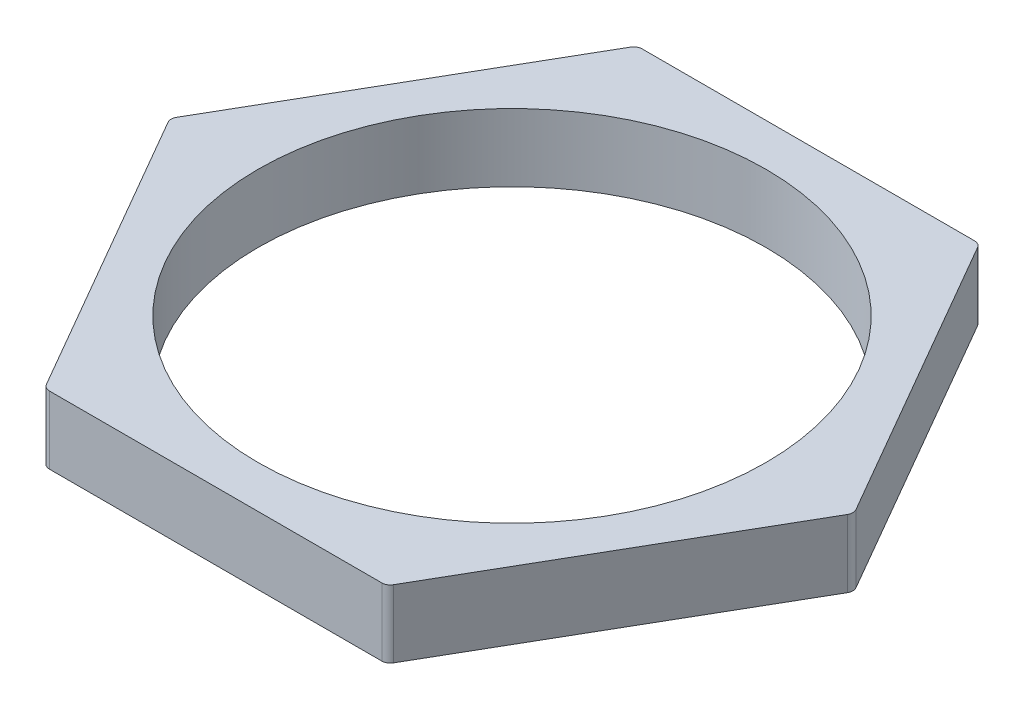
ISO-10303-21;
HEADER;
FILE_DESCRIPTION(('STEP AP214'),'2;1');
FILE_NAME('part.step','',(''),(''),'','','');
FILE_SCHEMA(('AUTOMOTIVE_DESIGN { 1 0 10303 214 1 1 1 1 }'));
ENDSEC;
DATA;
#1=APPLICATION_CONTEXT('core data for automotive mechanical design processes');
#2=APPLICATION_PROTOCOL_DEFINITION('international standard','automotive_design',2000,#1);
#3=PRODUCT_CONTEXT('',#1,'mechanical');
#4=PRODUCT('Part','Part','',(#3));
#5=PRODUCT_RELATED_PRODUCT_CATEGORY('part','',(#4));
#6=PRODUCT_DEFINITION_FORMATION('','',#4);
#7=PRODUCT_DEFINITION_CONTEXT('part definition',#1,'design');
#8=PRODUCT_DEFINITION('design','',#6,#7);
#9=PRODUCT_DEFINITION_SHAPE('','',#8);
#10=(LENGTH_UNIT() NAMED_UNIT(*) SI_UNIT(.MILLI.,.METRE.));
#11=(NAMED_UNIT(*) PLANE_ANGLE_UNIT() SI_UNIT($,.RADIAN.));
#12=(NAMED_UNIT(*) SI_UNIT($,.STERADIAN.) SOLID_ANGLE_UNIT());
#13=UNCERTAINTY_MEASURE_WITH_UNIT(LENGTH_MEASURE(1.E-05),#10,'distance_accuracy_value','');
#14=(GEOMETRIC_REPRESENTATION_CONTEXT(3) GLOBAL_UNCERTAINTY_ASSIGNED_CONTEXT((#13)) GLOBAL_UNIT_ASSIGNED_CONTEXT((#10,
#11,#12)) REPRESENTATION_CONTEXT('',''));
#15=CARTESIAN_POINT('',(0.,0.,0.));
#16=DIRECTION('',(0.,0.,1.));
#17=DIRECTION('',(1.,0.,0.));
#18=AXIS2_PLACEMENT_3D('',#15,#16,#17);
#19=CARTESIAN_POINT('',(9.81495457622364,0.,-17.));
#20=DIRECTION('',(0.,1.,0.));
#21=DIRECTION('',(0.,0.,1.));
#22=AXIS2_PLACEMENT_3D('',#19,#20,#21);
#23=CYLINDRICAL_SURFACE('',#22,0.5);
#24=CARTESIAN_POINT('',(9.81495457622364,4.,-17.));
#25=DIRECTION('',(0.,1.,0.));
#26=DIRECTION('',(0.,0.,1.));
#27=AXIS2_PLACEMENT_3D('',#24,#25,#26);
#28=CIRCLE('',#27,0.5);
#29=CARTESIAN_POINT('',(10.2479672781159,4.,-17.25));
#30=VERTEX_POINT('',#29);
#31=CARTESIAN_POINT('',(9.81495457622364,4.,-17.5));
#32=VERTEX_POINT('',#31);
#33=EDGE_CURVE('E155',#30,#32,#28,.T.);
#34=ORIENTED_EDGE('',*,*,#33,.F.);
#35=DIRECTION('',(0.,1.,0.));
#36=VECTOR('',#35,1.);
#37=CARTESIAN_POINT('',(10.2479672781159,0.,-17.25));
#38=LINE('',#37,#36);
#39=CARTESIAN_POINT('',(10.2479672781159,0.,-17.25));
#40=VERTEX_POINT('',#39);
#41=EDGE_CURVE('E11',#40,#30,#38,.T.);
#42=ORIENTED_EDGE('',*,*,#41,.F.);
#43=CARTESIAN_POINT('',(9.81495457622364,0.,-17.));
#44=DIRECTION('',(0.,1.,0.));
#45=DIRECTION('',(0.,0.,1.));
#46=AXIS2_PLACEMENT_3D('',#43,#44,#45);
#47=CIRCLE('',#46,0.5);
#48=CARTESIAN_POINT('',(9.81495457622364,0.,-17.5));
#49=VERTEX_POINT('',#48);
#50=EDGE_CURVE('E188',#40,#49,#47,.T.);
#51=ORIENTED_EDGE('',*,*,#50,.T.);
#52=DIRECTION('',(0.,1.,0.));
#53=VECTOR('',#52,1.);
#54=CARTESIAN_POINT('',(9.81495457622364,0.,-17.5));
#55=LINE('',#54,#53);
#56=EDGE_CURVE('E37',#49,#32,#55,.T.);
#57=ORIENTED_EDGE('',*,*,#56,.T.);
#58=EDGE_LOOP('',(#34,#42,#51,#57));
#59=FACE_BOUND('',#58,.T.);
#60=ADVANCED_FACE('F34',(#59),#23,.T.);
#61=CARTESIAN_POINT('',(20.0629218543395,0.,-0.250000000000003));
#62=DIRECTION('',(0.866025403784438,0.,-0.5));
#63=DIRECTION('',(-0.5,0.,-0.866025403784438));
#64=AXIS2_PLACEMENT_3D('',#61,#62,#63);
#65=PLANE('',#64);
#66=DIRECTION('',(-0.5,0.,-0.866025403784438));
#67=VECTOR('',#66,1.);
#68=CARTESIAN_POINT('',(20.0629218543395,4.,-0.250000000000003));
#69=LINE('',#68,#67);
#70=CARTESIAN_POINT('',(20.0629218543395,4.,-0.250000000000002));
#71=VERTEX_POINT('',#70);
#72=EDGE_CURVE('E186',#71,#30,#69,.T.);
#73=ORIENTED_EDGE('',*,*,#72,.F.);
#74=DIRECTION('',(0.,1.,0.));
#75=VECTOR('',#74,1.);
#76=CARTESIAN_POINT('',(20.0629218543395,0.,-0.250000000000002));
#77=LINE('',#76,#75);
#78=CARTESIAN_POINT('',(20.0629218543395,0.,-0.250000000000002));
#79=VERTEX_POINT('',#78);
#80=EDGE_CURVE('E43',#79,#71,#77,.T.);
#81=ORIENTED_EDGE('',*,*,#80,.F.);
#82=DIRECTION('',(-0.5,0.,-0.866025403784438));
#83=VECTOR('',#82,1.);
#84=CARTESIAN_POINT('',(20.0629218543395,0.,-0.250000000000003));
#85=LINE('',#84,#83);
#86=EDGE_CURVE('E145',#79,#40,#85,.T.);
#87=ORIENTED_EDGE('',*,*,#86,.T.);
#88=ORIENTED_EDGE('',*,*,#41,.T.);
#89=EDGE_LOOP('',(#73,#81,#87,#88));
#90=FACE_BOUND('',#89,.T.);
#91=ADVANCED_FACE('F208',(#90),#65,.T.);
#92=CARTESIAN_POINT('',(19.6299091524473,0.,0.));
#93=DIRECTION('',(0.,1.,0.));
#94=DIRECTION('',(0.,0.,1.));
#95=AXIS2_PLACEMENT_3D('',#92,#93,#94);
#96=CYLINDRICAL_SURFACE('',#95,0.499999999999999);
#97=CARTESIAN_POINT('',(19.6299091524473,4.,0.));
#98=DIRECTION('',(0.,1.,0.));
#99=DIRECTION('',(0.,0.,1.));
#100=AXIS2_PLACEMENT_3D('',#97,#98,#99);
#101=CIRCLE('',#100,0.499999999999999);
#102=CARTESIAN_POINT('',(20.0629218543395,4.,0.249999999999997));
#103=VERTEX_POINT('',#102);
#104=EDGE_CURVE('E132',#103,#71,#101,.T.);
#105=ORIENTED_EDGE('',*,*,#104,.F.);
#106=DIRECTION('',(0.,1.,0.));
#107=VECTOR('',#106,1.);
#108=CARTESIAN_POINT('',(20.0629218543395,0.,0.249999999999997));
#109=LINE('',#108,#107);
#110=CARTESIAN_POINT('',(20.0629218543395,0.,0.249999999999997));
#111=VERTEX_POINT('',#110);
#112=EDGE_CURVE('E127',#111,#103,#109,.T.);
#113=ORIENTED_EDGE('',*,*,#112,.F.);
#114=CARTESIAN_POINT('',(19.6299091524473,0.,0.));
#115=DIRECTION('',(0.,1.,0.));
#116=DIRECTION('',(0.,0.,1.));
#117=AXIS2_PLACEMENT_3D('',#114,#115,#116);
#118=CIRCLE('',#117,0.499999999999999);
#119=EDGE_CURVE('E130',#111,#79,#118,.T.);
#120=ORIENTED_EDGE('',*,*,#119,.T.);
#121=ORIENTED_EDGE('',*,*,#80,.T.);
#122=EDGE_LOOP('',(#105,#113,#120,#121));
#123=FACE_BOUND('',#122,.T.);
#124=ADVANCED_FACE('F129',(#123),#96,.T.);
#125=CARTESIAN_POINT('',(10.2479672781159,0.,17.25));
#126=DIRECTION('',(0.866025403784439,0.,0.5));
#127=DIRECTION('',(0.5,0.,-0.866025403784439));
#128=AXIS2_PLACEMENT_3D('',#125,#126,#127);
#129=PLANE('',#128);
#130=DIRECTION('',(0.5,0.,-0.866025403784439));
#131=VECTOR('',#130,1.);
#132=CARTESIAN_POINT('',(10.2479672781159,4.,17.25));
#133=LINE('',#132,#131);
#134=CARTESIAN_POINT('',(10.2479672781159,4.,17.25));
#135=VERTEX_POINT('',#134);
#136=EDGE_CURVE('E183',#135,#103,#133,.T.);
#137=ORIENTED_EDGE('',*,*,#136,.F.);
#138=DIRECTION('',(0.,1.,0.));
#139=VECTOR('',#138,1.);
#140=CARTESIAN_POINT('',(10.2479672781159,0.,17.25));
#141=LINE('',#140,#139);
#142=CARTESIAN_POINT('',(10.2479672781159,0.,17.25));
#143=VERTEX_POINT('',#142);
#144=EDGE_CURVE('E137',#143,#135,#141,.T.);
#145=ORIENTED_EDGE('',*,*,#144,.F.);
#146=DIRECTION('',(0.5,0.,-0.866025403784439));
#147=VECTOR('',#146,1.);
#148=CARTESIAN_POINT('',(10.2479672781159,0.,17.25));
#149=LINE('',#148,#147);
#150=EDGE_CURVE('E143',#143,#111,#149,.T.);
#151=ORIENTED_EDGE('',*,*,#150,.T.);
#152=ORIENTED_EDGE('',*,*,#112,.T.);
#153=EDGE_LOOP('',(#137,#145,#151,#152));
#154=FACE_BOUND('',#153,.T.);
#155=ADVANCED_FACE('F147',(#154),#129,.T.);
#156=CARTESIAN_POINT('',(9.81495457622365,0.,17.));
#157=DIRECTION('',(0.,1.,0.));
#158=DIRECTION('',(0.,0.,1.));
#159=AXIS2_PLACEMENT_3D('',#156,#157,#158);
#160=CYLINDRICAL_SURFACE('',#159,0.500000000000001);
#161=CARTESIAN_POINT('',(9.81495457622365,4.,17.));
#162=DIRECTION('',(0.,1.,0.));
#163=DIRECTION('',(0.,0.,1.));
#164=AXIS2_PLACEMENT_3D('',#161,#162,#163);
#165=CIRCLE('',#164,0.500000000000001);
#166=CARTESIAN_POINT('',(9.81495457622365,4.,17.5));
#167=VERTEX_POINT('',#166);
#168=EDGE_CURVE('E180',#167,#135,#165,.T.);
#169=ORIENTED_EDGE('',*,*,#168,.F.);
#170=DIRECTION('',(0.,1.,0.));
#171=VECTOR('',#170,1.);
#172=CARTESIAN_POINT('',(9.81495457622365,0.,17.5));
#173=LINE('',#172,#171);
#174=CARTESIAN_POINT('',(9.81495457622365,0.,17.5));
#175=VERTEX_POINT('',#174);
#176=EDGE_CURVE('E192',#175,#167,#173,.T.);
#177=ORIENTED_EDGE('',*,*,#176,.F.);
#178=CARTESIAN_POINT('',(9.81495457622365,0.,17.));
#179=DIRECTION('',(0.,1.,0.));
#180=DIRECTION('',(0.,0.,1.));
#181=AXIS2_PLACEMENT_3D('',#178,#179,#180);
#182=CIRCLE('',#181,0.500000000000001);
#183=EDGE_CURVE('E148',#175,#143,#182,.T.);
#184=ORIENTED_EDGE('',*,*,#183,.T.);
#185=ORIENTED_EDGE('',*,*,#144,.T.);
#186=EDGE_LOOP('',(#169,#177,#184,#185));
#187=FACE_BOUND('',#186,.T.);
#188=ADVANCED_FACE('F221',(#187),#160,.T.);
#189=CARTESIAN_POINT('',(-9.81495457622363,0.,17.5));
#190=DIRECTION('',(0.,0.,1.));
#191=DIRECTION('',(1.,0.,0.));
#192=AXIS2_PLACEMENT_3D('',#189,#190,#191);
#193=PLANE('',#192);
#194=DIRECTION('',(1.,0.,0.));
#195=VECTOR('',#194,1.);
#196=CARTESIAN_POINT('',(-9.81495457622363,4.,17.5));
#197=LINE('',#196,#195);
#198=CARTESIAN_POINT('',(-9.81495457622363,4.,17.5));
#199=VERTEX_POINT('',#198);
#200=EDGE_CURVE('E177',#199,#167,#197,.T.);
#201=ORIENTED_EDGE('',*,*,#200,.F.);
#202=DIRECTION('',(0.,1.,0.));
#203=VECTOR('',#202,1.);
#204=CARTESIAN_POINT('',(-9.81495457622363,0.,17.5));
#205=LINE('',#204,#203);
#206=CARTESIAN_POINT('',(-9.81495457622363,0.,17.5));
#207=VERTEX_POINT('',#206);
#208=EDGE_CURVE('E194',#207,#199,#205,.T.);
#209=ORIENTED_EDGE('',*,*,#208,.F.);
#210=DIRECTION('',(1.,0.,0.));
#211=VECTOR('',#210,1.);
#212=CARTESIAN_POINT('',(-9.81495457622363,0.,17.5));
#213=LINE('',#212,#211);
#214=EDGE_CURVE('E150',#207,#175,#213,.T.);
#215=ORIENTED_EDGE('',*,*,#214,.T.);
#216=ORIENTED_EDGE('',*,*,#176,.T.);
#217=EDGE_LOOP('',(#201,#209,#215,#216));
#218=FACE_BOUND('',#217,.T.);
#219=ADVANCED_FACE('F224',(#218),#193,.T.);
#220=CARTESIAN_POINT('',(-9.81495457622363,0.,17.));
#221=DIRECTION('',(0.,1.,0.));
#222=DIRECTION('',(0.,0.,1.));
#223=AXIS2_PLACEMENT_3D('',#220,#221,#222);
#224=CYLINDRICAL_SURFACE('',#223,0.499999999999999);
#225=CARTESIAN_POINT('',(-9.81495457622363,4.,17.));
#226=DIRECTION('',(0.,1.,0.));
#227=DIRECTION('',(0.,0.,1.));
#228=AXIS2_PLACEMENT_3D('',#225,#226,#227);
#229=CIRCLE('',#228,0.499999999999999);
#230=CARTESIAN_POINT('',(-10.2479672781158,4.,17.25));
#231=VERTEX_POINT('',#230);
#232=EDGE_CURVE('E174',#231,#199,#229,.T.);
#233=ORIENTED_EDGE('',*,*,#232,.F.);
#234=DIRECTION('',(0.,1.,0.));
#235=VECTOR('',#234,1.);
#236=CARTESIAN_POINT('',(-10.2479672781158,0.,17.25));
#237=LINE('',#236,#235);
#238=CARTESIAN_POINT('',(-10.2479672781158,0.,17.25));
#239=VERTEX_POINT('',#238);
#240=EDGE_CURVE('E196',#239,#231,#237,.T.);
#241=ORIENTED_EDGE('',*,*,#240,.F.);
#242=CARTESIAN_POINT('',(-9.81495457622363,0.,17.));
#243=DIRECTION('',(0.,1.,0.));
#244=DIRECTION('',(0.,0.,1.));
#245=AXIS2_PLACEMENT_3D('',#242,#243,#244);
#246=CIRCLE('',#245,0.499999999999999);
#247=EDGE_CURVE('E287',#239,#207,#246,.T.);
#248=ORIENTED_EDGE('',*,*,#247,.T.);
#249=ORIENTED_EDGE('',*,*,#208,.T.);
#250=EDGE_LOOP('',(#233,#241,#248,#249));
#251=FACE_BOUND('',#250,.T.);
#252=ADVANCED_FACE('F228',(#251),#224,.T.);
#253=CARTESIAN_POINT('',(-20.0629218543395,0.,0.250000000000013));
#254=DIRECTION('',(-0.866025403784439,0.,0.5));
#255=DIRECTION('',(0.5,0.,0.866025403784438));
#256=AXIS2_PLACEMENT_3D('',#253,#254,#255);
#257=PLANE('',#256);
#258=DIRECTION('',(0.5,0.,0.866025403784438));
#259=VECTOR('',#258,1.);
#260=CARTESIAN_POINT('',(-20.0629218543395,4.,0.250000000000013));
#261=LINE('',#260,#259);
#262=CARTESIAN_POINT('',(-20.0629218543395,4.,0.250000000000013));
#263=VERTEX_POINT('',#262);
#264=EDGE_CURVE('E171',#263,#231,#261,.T.);
#265=ORIENTED_EDGE('',*,*,#264,.F.);
#266=DIRECTION('',(0.,1.,0.));
#267=VECTOR('',#266,1.);
#268=CARTESIAN_POINT('',(-20.0629218543395,0.,0.250000000000013));
#269=LINE('',#268,#267);
#270=CARTESIAN_POINT('',(-20.0629218543395,0.,0.250000000000013));
#271=VERTEX_POINT('',#270);
#272=EDGE_CURVE('E198',#271,#263,#269,.T.);
#273=ORIENTED_EDGE('',*,*,#272,.F.);
#274=DIRECTION('',(0.5,0.,0.866025403784438));
#275=VECTOR('',#274,1.);
#276=CARTESIAN_POINT('',(-20.0629218543395,0.,0.250000000000013));
#277=LINE('',#276,#275);
#278=EDGE_CURVE('E284',#271,#239,#277,.T.);
#279=ORIENTED_EDGE('',*,*,#278,.T.);
#280=ORIENTED_EDGE('',*,*,#240,.T.);
#281=EDGE_LOOP('',(#265,#273,#279,#280));
#282=FACE_BOUND('',#281,.T.);
#283=ADVANCED_FACE('F232',(#282),#257,.T.);
#284=CARTESIAN_POINT('',(-19.6299091524473,0.,0.));
#285=DIRECTION('',(0.,1.,0.));
#286=DIRECTION('',(0.,0.,1.));
#287=AXIS2_PLACEMENT_3D('',#284,#285,#286);
#288=CYLINDRICAL_SURFACE('',#287,0.499999999999999);
#289=CARTESIAN_POINT('',(-19.6299091524473,4.,0.));
#290=DIRECTION('',(0.,1.,0.));
#291=DIRECTION('',(0.,0.,1.));
#292=AXIS2_PLACEMENT_3D('',#289,#290,#291);
#293=CIRCLE('',#292,0.499999999999999);
#294=CARTESIAN_POINT('',(-20.0629218543395,4.,-0.249999999999986));
#295=VERTEX_POINT('',#294);
#296=EDGE_CURVE('E168',#295,#263,#293,.T.);
#297=ORIENTED_EDGE('',*,*,#296,.F.);
#298=DIRECTION('',(0.,1.,0.));
#299=VECTOR('',#298,1.);
#300=CARTESIAN_POINT('',(-20.0629218543395,0.,-0.249999999999986));
#301=LINE('',#300,#299);
#302=CARTESIAN_POINT('',(-20.0629218543395,0.,-0.249999999999986));
#303=VERTEX_POINT('',#302);
#304=EDGE_CURVE('E200',#303,#295,#301,.T.);
#305=ORIENTED_EDGE('',*,*,#304,.F.);
#306=CARTESIAN_POINT('',(-19.6299091524473,0.,0.));
#307=DIRECTION('',(0.,1.,0.));
#308=DIRECTION('',(0.,0.,1.));
#309=AXIS2_PLACEMENT_3D('',#306,#307,#308);
#310=CIRCLE('',#309,0.499999999999999);
#311=EDGE_CURVE('E281',#303,#271,#310,.T.);
#312=ORIENTED_EDGE('',*,*,#311,.T.);
#313=ORIENTED_EDGE('',*,*,#272,.T.);
#314=EDGE_LOOP('',(#297,#305,#312,#313));
#315=FACE_BOUND('',#314,.T.);
#316=ADVANCED_FACE('F236',(#315),#288,.T.);
#317=CARTESIAN_POINT('',(-10.2479672781159,0.,-17.25));
#318=DIRECTION('',(-0.866025403784439,0.,-0.5));
#319=DIRECTION('',(-0.5,0.,0.866025403784439));
#320=AXIS2_PLACEMENT_3D('',#317,#318,#319);
#321=PLANE('',#320);
#322=DIRECTION('',(-0.499999999999999,0.,0.866025403784439));
#323=VECTOR('',#322,1.);
#324=CARTESIAN_POINT('',(-10.2479672781159,4.,-17.25));
#325=LINE('',#324,#323);
#326=CARTESIAN_POINT('',(-10.2479672781159,4.,-17.25));
#327=VERTEX_POINT('',#326);
#328=EDGE_CURVE('E165',#327,#295,#325,.T.);
#329=ORIENTED_EDGE('',*,*,#328,.F.);
#330=DIRECTION('',(0.,1.,0.));
#331=VECTOR('',#330,1.);
#332=CARTESIAN_POINT('',(-10.2479672781159,0.,-17.25));
#333=LINE('',#332,#331);
#334=CARTESIAN_POINT('',(-10.2479672781159,0.,-17.25));
#335=VERTEX_POINT('',#334);
#336=EDGE_CURVE('E202',#335,#327,#333,.T.);
#337=ORIENTED_EDGE('',*,*,#336,.F.);
#338=DIRECTION('',(-0.499999999999999,0.,0.866025403784439));
#339=VECTOR('',#338,1.);
#340=CARTESIAN_POINT('',(-10.2479672781159,0.,-17.25));
#341=LINE('',#340,#339);
#342=EDGE_CURVE('E278',#335,#303,#341,.T.);
#343=ORIENTED_EDGE('',*,*,#342,.T.);
#344=ORIENTED_EDGE('',*,*,#304,.T.);
#345=EDGE_LOOP('',(#329,#337,#343,#344));
#346=FACE_BOUND('',#345,.T.);
#347=ADVANCED_FACE('F240',(#346),#321,.T.);
#348=CARTESIAN_POINT('',(-9.81495457622364,0.,-17.));
#349=DIRECTION('',(0.,1.,0.));
#350=DIRECTION('',(0.,0.,1.));
#351=AXIS2_PLACEMENT_3D('',#348,#349,#350);
#352=CYLINDRICAL_SURFACE('',#351,0.5);
#353=CARTESIAN_POINT('',(-9.81495457622364,4.,-17.));
#354=DIRECTION('',(0.,1.,0.));
#355=DIRECTION('',(0.,0.,1.));
#356=AXIS2_PLACEMENT_3D('',#353,#354,#355);
#357=CIRCLE('',#356,0.5);
#358=CARTESIAN_POINT('',(-9.81495457622364,4.,-17.5));
#359=VERTEX_POINT('',#358);
#360=EDGE_CURVE('E162',#359,#327,#357,.T.);
#361=ORIENTED_EDGE('',*,*,#360,.F.);
#362=DIRECTION('',(0.,1.,0.));
#363=VECTOR('',#362,1.);
#364=CARTESIAN_POINT('',(-9.81495457622364,0.,-17.5));
#365=LINE('',#364,#363);
#366=CARTESIAN_POINT('',(-9.81495457622364,0.,-17.5));
#367=VERTEX_POINT('',#366);
#368=EDGE_CURVE('E203',#367,#359,#365,.T.);
#369=ORIENTED_EDGE('',*,*,#368,.F.);
#370=CARTESIAN_POINT('',(-9.81495457622364,0.,-17.));
#371=DIRECTION('',(0.,1.,0.));
#372=DIRECTION('',(0.,0.,1.));
#373=AXIS2_PLACEMENT_3D('',#370,#371,#372);
#374=CIRCLE('',#373,0.5);
#375=EDGE_CURVE('E275',#367,#335,#374,.T.);
#376=ORIENTED_EDGE('',*,*,#375,.T.);
#377=ORIENTED_EDGE('',*,*,#336,.T.);
#378=EDGE_LOOP('',(#361,#369,#376,#377));
#379=FACE_BOUND('',#378,.T.);
#380=ADVANCED_FACE('F244',(#379),#352,.T.);
#381=CARTESIAN_POINT('',(9.81495457622364,0.,-17.5));
#382=DIRECTION('',(0.,0.,-1.));
#383=DIRECTION('',(-1.,0.,0.));
#384=AXIS2_PLACEMENT_3D('',#381,#382,#383);
#385=PLANE('',#384);
#386=DIRECTION('',(-1.,0.,0.));
#387=VECTOR('',#386,1.);
#388=CARTESIAN_POINT('',(9.81495457622364,4.,-17.5));
#389=LINE('',#388,#387);
#390=EDGE_CURVE('E158',#32,#359,#389,.T.);
#391=ORIENTED_EDGE('',*,*,#390,.F.);
#392=ORIENTED_EDGE('',*,*,#56,.F.);
#393=DIRECTION('',(-1.,0.,0.));
#394=VECTOR('',#393,1.);
#395=CARTESIAN_POINT('',(9.81495457622364,0.,-17.5));
#396=LINE('',#395,#394);
#397=EDGE_CURVE('E273',#49,#367,#396,.T.);
#398=ORIENTED_EDGE('',*,*,#397,.T.);
#399=ORIENTED_EDGE('',*,*,#368,.T.);
#400=EDGE_LOOP('',(#391,#392,#398,#399));
#401=FACE_BOUND('',#400,.T.);
#402=ADVANCED_FACE('F205',(#401),#385,.T.);
#403=CARTESIAN_POINT('',(9.81495457622364,0.,-17.));
#404=DIRECTION('',(0.,1.,0.));
#405=DIRECTION('',(0.,0.,1.));
#406=AXIS2_PLACEMENT_3D('',#403,#404,#405);
#407=PLANE('',#406);
#408=CARTESIAN_POINT('',(0.,0.,0.));
#409=DIRECTION('',(0.,1.,0.));
#410=DIRECTION('',(0.,0.,-1.));
#411=AXIS2_PLACEMENT_3D('',#408,#409,#410);
#412=CIRCLE('',#411,15.);
#413=CARTESIAN_POINT('',(0.,0.,-15.));
#414=VERTEX_POINT('',#413);
#415=EDGE_CURVE('E159',#414,#414,#412,.T.);
#416=ORIENTED_EDGE('',*,*,#415,.T.);
#417=EDGE_LOOP('',(#416));
#418=FACE_BOUND('',#417,.T.);
#419=ORIENTED_EDGE('',*,*,#50,.F.);
#420=ORIENTED_EDGE('',*,*,#86,.F.);
#421=ORIENTED_EDGE('',*,*,#119,.F.);
#422=ORIENTED_EDGE('',*,*,#150,.F.);
#423=ORIENTED_EDGE('',*,*,#183,.F.);
#424=ORIENTED_EDGE('',*,*,#214,.F.);
#425=ORIENTED_EDGE('',*,*,#247,.F.);
#426=ORIENTED_EDGE('',*,*,#278,.F.);
#427=ORIENTED_EDGE('',*,*,#311,.F.);
#428=ORIENTED_EDGE('',*,*,#342,.F.);
#429=ORIENTED_EDGE('',*,*,#375,.F.);
#430=ORIENTED_EDGE('',*,*,#397,.F.);
#431=EDGE_LOOP('',(#419,#420,#421,#422,#423,#424,#425,#426,#427,#428,#429,#430));
#432=FACE_BOUND('',#431,.T.);
#433=ADVANCED_FACE('F141',(#418,#432),#407,.F.);
#434=CARTESIAN_POINT('',(9.81495457622364,4.,-17.));
#435=DIRECTION('',(0.,1.,0.));
#436=DIRECTION('',(0.,0.,1.));
#437=AXIS2_PLACEMENT_3D('',#434,#435,#436);
#438=PLANE('',#437);
#439=CARTESIAN_POINT('',(0.,4.,0.));
#440=DIRECTION('',(0.,1.,0.));
#441=DIRECTION('',(0.,0.,-1.));
#442=AXIS2_PLACEMENT_3D('',#439,#440,#441);
#443=CIRCLE('',#442,15.);
#444=CARTESIAN_POINT('',(0.,4.,-15.));
#445=VERTEX_POINT('',#444);
#446=EDGE_CURVE('E268',#445,#445,#443,.T.);
#447=ORIENTED_EDGE('',*,*,#446,.F.);
#448=EDGE_LOOP('',(#447));
#449=FACE_BOUND('',#448,.T.);
#450=ORIENTED_EDGE('',*,*,#33,.T.);
#451=ORIENTED_EDGE('',*,*,#390,.T.);
#452=ORIENTED_EDGE('',*,*,#360,.T.);
#453=ORIENTED_EDGE('',*,*,#328,.T.);
#454=ORIENTED_EDGE('',*,*,#296,.T.);
#455=ORIENTED_EDGE('',*,*,#264,.T.);
#456=ORIENTED_EDGE('',*,*,#232,.T.);
#457=ORIENTED_EDGE('',*,*,#200,.T.);
#458=ORIENTED_EDGE('',*,*,#168,.T.);
#459=ORIENTED_EDGE('',*,*,#136,.T.);
#460=ORIENTED_EDGE('',*,*,#104,.T.);
#461=ORIENTED_EDGE('',*,*,#72,.T.);
#462=EDGE_LOOP('',(#450,#451,#452,#453,#454,#455,#456,#457,#458,#459,#460,#461));
#463=FACE_BOUND('',#462,.T.);
#464=ADVANCED_FACE('F207',(#449,#463),#438,.T.);
#465=CARTESIAN_POINT('',(0.,0.,0.));
#466=DIRECTION('',(0.,1.,0.));
#467=DIRECTION('',(0.,0.,1.));
#468=AXIS2_PLACEMENT_3D('',#465,#466,#467);
#469=CYLINDRICAL_SURFACE('',#468,15.);
#470=ORIENTED_EDGE('',*,*,#415,.F.);
#471=EDGE_LOOP('',(#470));
#472=FACE_BOUND('',#471,.T.);
#473=ORIENTED_EDGE('',*,*,#446,.T.);
#474=EDGE_LOOP('',(#473));
#475=FACE_BOUND('',#474,.T.);
#476=ADVANCED_FACE('F256',(#472,#475),#469,.F.);
#477=CLOSED_SHELL('',(#60,#91,#124,#155,#188,#219,#252,#283,#316,#347,#380,#402,#433,#464,#476));
#478=MANIFOLD_SOLID_BREP('B2',#477);
#479=ADVANCED_BREP_SHAPE_REPRESENTATION('',(#18,#478),#14);
#480=SHAPE_DEFINITION_REPRESENTATION(#9,#479);
ENDSEC;
END-ISO-10303-21;
